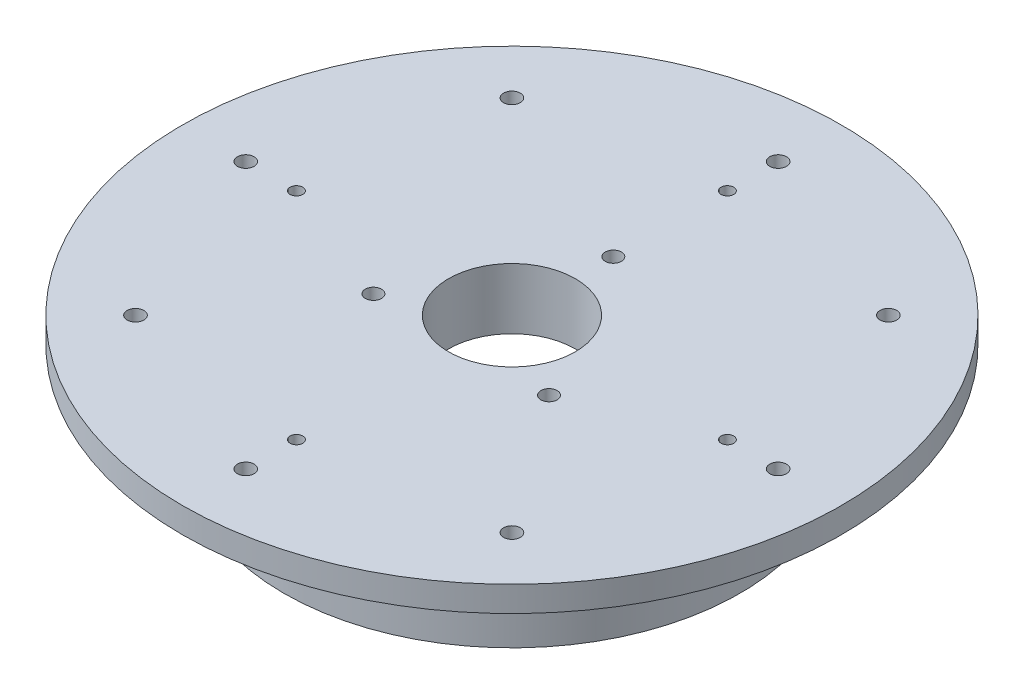
ISO-10303-21;
HEADER;
FILE_DESCRIPTION(('STEP AP214'),'2;1');
FILE_NAME('part.step','',(''),(''),'','','');
FILE_SCHEMA(('AUTOMOTIVE_DESIGN { 1 0 10303 214 1 1 1 1 }'));
ENDSEC;
DATA;
#1=APPLICATION_CONTEXT('core data for automotive mechanical design processes');
#2=APPLICATION_PROTOCOL_DEFINITION('international standard','automotive_design',2000,#1);
#3=PRODUCT_CONTEXT('',#1,'mechanical');
#4=PRODUCT('Part','Part','',(#3));
#5=PRODUCT_RELATED_PRODUCT_CATEGORY('part','',(#4));
#6=PRODUCT_DEFINITION_FORMATION('','',#4);
#7=PRODUCT_DEFINITION_CONTEXT('part definition',#1,'design');
#8=PRODUCT_DEFINITION('design','',#6,#7);
#9=PRODUCT_DEFINITION_SHAPE('','',#8);
#10=(LENGTH_UNIT() NAMED_UNIT(*) SI_UNIT(.MILLI.,.METRE.));
#11=(NAMED_UNIT(*) PLANE_ANGLE_UNIT() SI_UNIT($,.RADIAN.));
#12=(NAMED_UNIT(*) SI_UNIT($,.STERADIAN.) SOLID_ANGLE_UNIT());
#13=UNCERTAINTY_MEASURE_WITH_UNIT(LENGTH_MEASURE(1.E-05),#10,'distance_accuracy_value','');
#14=(GEOMETRIC_REPRESENTATION_CONTEXT(3) GLOBAL_UNCERTAINTY_ASSIGNED_CONTEXT((#13)) GLOBAL_UNIT_ASSIGNED_CONTEXT((#10,
#11,#12)) REPRESENTATION_CONTEXT('',''));
#15=CARTESIAN_POINT('',(0.,0.,0.));
#16=DIRECTION('',(0.,0.,1.));
#17=DIRECTION('',(1.,0.,0.));
#18=AXIS2_PLACEMENT_3D('',#15,#16,#17);
#19=CARTESIAN_POINT('',(0.,-7.,0.));
#20=DIRECTION('',(0.,-1.,0.));
#21=DIRECTION('',(0.,0.,-1.));
#22=AXIS2_PLACEMENT_3D('',#19,#20,#21);
#23=PLANE('',#22);
#24=CARTESIAN_POINT('',(-17.3205080756875,-7.,10.0000000000007));
#25=DIRECTION('',(0.,-1.,0.));
#26=DIRECTION('',(0.,0.,-1.));
#27=AXIS2_PLACEMENT_3D('',#24,#25,#26);
#28=CIRCLE('',#27,1.60000000000161);
#29=CARTESIAN_POINT('',(-17.3205080756875,-7.,8.39999999999913));
#30=VERTEX_POINT('',#29);
#31=EDGE_CURVE('E142',#30,#30,#28,.T.);
#32=ORIENTED_EDGE('',*,*,#31,.F.);
#33=EDGE_LOOP('',(#32));
#34=FACE_BOUND('',#33,.T.);
#35=CARTESIAN_POINT('',(17.3205080756901,-7.,9.99999999999926));
#36=DIRECTION('',(0.,-1.,0.));
#37=DIRECTION('',(0.,0.,-1.));
#38=AXIS2_PLACEMENT_3D('',#35,#36,#37);
#39=CIRCLE('',#38,1.60000000000109);
#40=CARTESIAN_POINT('',(17.3205080756901,-7.,8.39999999999817));
#41=VERTEX_POINT('',#40);
#42=EDGE_CURVE('E157',#41,#41,#39,.T.);
#43=ORIENTED_EDGE('',*,*,#42,.F.);
#44=EDGE_LOOP('',(#43));
#45=FACE_BOUND('',#44,.T.);
#46=CARTESIAN_POINT('',(0.,-7.,-20.));
#47=DIRECTION('',(0.,-1.,0.));
#48=DIRECTION('',(0.,0.,-1.));
#49=AXIS2_PLACEMENT_3D('',#46,#47,#48);
#50=CIRCLE('',#49,1.6);
#51=CARTESIAN_POINT('',(0.,-7.,-21.6));
#52=VERTEX_POINT('',#51);
#53=EDGE_CURVE('E53',#52,#52,#50,.T.);
#54=ORIENTED_EDGE('',*,*,#53,.F.);
#55=EDGE_LOOP('',(#54));
#56=FACE_BOUND('',#55,.T.);
#57=CARTESIAN_POINT('',(0.,-7.,0.));
#58=DIRECTION('',(0.,-1.,0.));
#59=DIRECTION('',(0.,0.,-1.));
#60=AXIS2_PLACEMENT_3D('',#57,#58,#59);
#61=CIRCLE('',#60,12.5);
#62=CARTESIAN_POINT('',(0.,-7.,-12.5));
#63=VERTEX_POINT('',#62);
#64=EDGE_CURVE('E130',#63,#63,#61,.T.);
#65=ORIENTED_EDGE('',*,*,#64,.F.);
#66=EDGE_LOOP('',(#65));
#67=FACE_BOUND('',#66,.T.);
#68=CARTESIAN_POINT('',(0.,-7.,0.));
#69=DIRECTION('',(0.,-1.,0.));
#70=DIRECTION('',(0.,0.,-1.));
#71=AXIS2_PLACEMENT_3D('',#68,#69,#70);
#72=CIRCLE('',#71,40.);
#73=CARTESIAN_POINT('',(0.,-7.,40.));
#74=VERTEX_POINT('',#73);
#75=EDGE_CURVE('E10',#74,#74,#72,.F.);
#76=ORIENTED_EDGE('',*,*,#75,.F.);
#77=EDGE_LOOP('',(#76));
#78=FACE_BOUND('',#77,.T.);
#79=ADVANCED_FACE('F36',(#34,#45,#56,#67,#78),#23,.T.);
#80=CARTESIAN_POINT('',(0.,5.,0.));
#81=DIRECTION('',(0.,-1.,0.));
#82=DIRECTION('',(0.,0.,-1.));
#83=AXIS2_PLACEMENT_3D('',#80,#81,#82);
#84=CYLINDRICAL_SURFACE('',#83,65.);
#85=CARTESIAN_POINT('',(0.,5.,0.));
#86=DIRECTION('',(0.,1.,0.));
#87=DIRECTION('',(0.,0.,1.));
#88=AXIS2_PLACEMENT_3D('',#85,#86,#87);
#89=CIRCLE('',#88,65.);
#90=CARTESIAN_POINT('',(0.,5.,65.));
#91=VERTEX_POINT('',#90);
#92=EDGE_CURVE('E49',#91,#91,#89,.T.);
#93=ORIENTED_EDGE('',*,*,#92,.F.);
#94=EDGE_LOOP('',(#93));
#95=FACE_BOUND('',#94,.T.);
#96=CARTESIAN_POINT('',(0.,0.,0.));
#97=DIRECTION('',(0.,1.,0.));
#98=DIRECTION('',(0.,0.,1.));
#99=AXIS2_PLACEMENT_3D('',#96,#97,#98);
#100=CIRCLE('',#99,65.);
#101=CARTESIAN_POINT('',(0.,0.,65.));
#102=VERTEX_POINT('',#101);
#103=EDGE_CURVE('E150',#102,#102,#100,.T.);
#104=ORIENTED_EDGE('',*,*,#103,.T.);
#105=EDGE_LOOP('',(#104));
#106=FACE_BOUND('',#105,.T.);
#107=ADVANCED_FACE('F38',(#95,#106),#84,.T.);
#108=CARTESIAN_POINT('',(0.,5.,0.));
#109=DIRECTION('',(0.,1.,0.));
#110=DIRECTION('',(0.,0.,1.));
#111=AXIS2_PLACEMENT_3D('',#108,#109,#110);
#112=PLANE('',#111);
#113=CARTESIAN_POINT('',(0.,5.,-52.5));
#114=DIRECTION('',(0.,1.,0.));
#115=DIRECTION('',(0.,0.,1.));
#116=AXIS2_PLACEMENT_3D('',#113,#114,#115);
#117=CIRCLE('',#116,1.64999999999999);
#118=CARTESIAN_POINT('',(0.,5.,-50.85));
#119=VERTEX_POINT('',#118);
#120=EDGE_CURVE('E496',#119,#119,#117,.T.);
#121=ORIENTED_EDGE('',*,*,#120,.F.);
#122=EDGE_LOOP('',(#121));
#123=FACE_BOUND('',#122,.T.);
#124=CARTESIAN_POINT('',(37.1231060122944,5.,-37.1231060122954));
#125=DIRECTION('',(0.,1.,0.));
#126=DIRECTION('',(0.,0.,1.));
#127=AXIS2_PLACEMENT_3D('',#124,#125,#126);
#128=CIRCLE('',#127,1.64999999999999);
#129=CARTESIAN_POINT('',(37.1231060122944,5.,-35.4731060122954));
#130=VERTEX_POINT('',#129);
#131=EDGE_CURVE('E77',#130,#130,#128,.T.);
#132=ORIENTED_EDGE('',*,*,#131,.F.);
#133=EDGE_LOOP('',(#132));
#134=FACE_BOUND('',#133,.T.);
#135=CARTESIAN_POINT('',(52.5000000000023,5.,-2.33453461106547E-12));
#136=DIRECTION('',(0.,1.,0.));
#137=DIRECTION('',(0.,0.,1.));
#138=AXIS2_PLACEMENT_3D('',#135,#136,#137);
#139=CIRCLE('',#138,1.64999999999999);
#140=CARTESIAN_POINT('',(52.5000000000023,5.,1.64999999999766));
#141=VERTEX_POINT('',#140);
#142=EDGE_CURVE('E66',#141,#141,#139,.T.);
#143=ORIENTED_EDGE('',*,*,#142,.F.);
#144=EDGE_LOOP('',(#143));
#145=FACE_BOUND('',#144,.T.);
#146=CARTESIAN_POINT('',(37.1231060122977,5.,37.1231060122921));
#147=DIRECTION('',(0.,1.,0.));
#148=DIRECTION('',(0.,0.,1.));
#149=AXIS2_PLACEMENT_3D('',#146,#147,#148);
#150=CIRCLE('',#149,1.64999999999999);
#151=CARTESIAN_POINT('',(37.1231060122977,5.,38.7731060122921));
#152=VERTEX_POINT('',#151);
#153=EDGE_CURVE('E63',#152,#152,#150,.T.);
#154=ORIENTED_EDGE('',*,*,#153,.F.);
#155=EDGE_LOOP('',(#154));
#156=FACE_BOUND('',#155,.T.);
#157=CARTESIAN_POINT('',(4.66906922213094E-12,5.,52.5));
#158=DIRECTION('',(0.,1.,0.));
#159=DIRECTION('',(0.,0.,1.));
#160=AXIS2_PLACEMENT_3D('',#157,#158,#159);
#161=CIRCLE('',#160,1.64999999999999);
#162=CARTESIAN_POINT('',(4.66906922213094E-12,5.,54.15));
#163=VERTEX_POINT('',#162);
#164=EDGE_CURVE('E62',#163,#163,#161,.T.);
#165=ORIENTED_EDGE('',*,*,#164,.F.);
#166=EDGE_LOOP('',(#165));
#167=FACE_BOUND('',#166,.T.);
#168=CARTESIAN_POINT('',(-37.1231060122898,5.,37.1231060122954));
#169=DIRECTION('',(0.,1.,0.));
#170=DIRECTION('',(0.,0.,1.));
#171=AXIS2_PLACEMENT_3D('',#168,#169,#170);
#172=CIRCLE('',#171,1.64999999999999);
#173=CARTESIAN_POINT('',(-37.1231060122898,5.,38.7731060122954));
#174=VERTEX_POINT('',#173);
#175=EDGE_CURVE('E86',#174,#174,#172,.T.);
#176=ORIENTED_EDGE('',*,*,#175,.F.);
#177=EDGE_LOOP('',(#176));
#178=FACE_BOUND('',#177,.T.);
#179=CARTESIAN_POINT('',(-52.4999999999977,5.,2.340964006761E-12));
#180=DIRECTION('',(0.,1.,0.));
#181=DIRECTION('',(0.,0.,1.));
#182=AXIS2_PLACEMENT_3D('',#179,#180,#181);
#183=CIRCLE('',#182,1.64999999999999);
#184=CARTESIAN_POINT('',(-52.4999999999977,5.,1.65000000000233));
#185=VERTEX_POINT('',#184);
#186=EDGE_CURVE('E92',#185,#185,#183,.T.);
#187=ORIENTED_EDGE('',*,*,#186,.F.);
#188=EDGE_LOOP('',(#187));
#189=FACE_BOUND('',#188,.T.);
#190=CARTESIAN_POINT('',(-37.1231060122931,5.,-37.1231060122921));
#191=DIRECTION('',(0.,1.,0.));
#192=DIRECTION('',(0.,0.,1.));
#193=AXIS2_PLACEMENT_3D('',#190,#191,#192);
#194=CIRCLE('',#193,1.64999999999999);
#195=CARTESIAN_POINT('',(-37.1231060122931,5.,-35.4731060122921));
#196=VERTEX_POINT('',#195);
#197=EDGE_CURVE('E59',#196,#196,#194,.T.);
#198=ORIENTED_EDGE('',*,*,#197,.F.);
#199=EDGE_LOOP('',(#198));
#200=FACE_BOUND('',#199,.T.);
#201=CARTESIAN_POINT('',(0.,5.,42.5));
#202=DIRECTION('',(0.,-1.,0.));
#203=DIRECTION('',(0.,0.,-1.));
#204=AXIS2_PLACEMENT_3D('',#201,#202,#203);
#205=CIRCLE('',#204,1.25);
#206=CARTESIAN_POINT('',(0.,5.,41.25));
#207=VERTEX_POINT('',#206);
#208=EDGE_CURVE('E102',#207,#207,#205,.T.);
#209=ORIENTED_EDGE('',*,*,#208,.T.);
#210=EDGE_LOOP('',(#209));
#211=FACE_BOUND('',#210,.T.);
#212=CARTESIAN_POINT('',(-42.5,5.,4.451638707025E-13));
#213=DIRECTION('',(0.,-1.,0.));
#214=DIRECTION('',(0.,0.,-1.));
#215=AXIS2_PLACEMENT_3D('',#212,#213,#214);
#216=CIRCLE('',#215,1.24999999999999);
#217=CARTESIAN_POINT('',(-42.5,5.,-1.24999999999955));
#218=VERTEX_POINT('',#217);
#219=EDGE_CURVE('E108',#218,#218,#216,.T.);
#220=ORIENTED_EDGE('',*,*,#219,.T.);
#221=EDGE_LOOP('',(#220));
#222=FACE_BOUND('',#221,.T.);
#223=CARTESIAN_POINT('',(-2.96775913801666E-13,5.,-42.5));
#224=DIRECTION('',(0.,-1.,0.));
#225=DIRECTION('',(0.,0.,-1.));
#226=AXIS2_PLACEMENT_3D('',#223,#224,#225);
#227=CIRCLE('',#226,1.25);
#228=CARTESIAN_POINT('',(-2.96775913801666E-13,5.,-43.75));
#229=VERTEX_POINT('',#228);
#230=EDGE_CURVE('E114',#229,#229,#227,.T.);
#231=ORIENTED_EDGE('',*,*,#230,.T.);
#232=EDGE_LOOP('',(#231));
#233=FACE_BOUND('',#232,.T.);
#234=CARTESIAN_POINT('',(42.5,5.,-1.48387956900833E-13));
#235=DIRECTION('',(0.,-1.,0.));
#236=DIRECTION('',(0.,0.,-1.));
#237=AXIS2_PLACEMENT_3D('',#234,#235,#236);
#238=CIRCLE('',#237,1.24999999999999);
#239=CARTESIAN_POINT('',(42.5,5.,-1.25000000000014));
#240=VERTEX_POINT('',#239);
#241=EDGE_CURVE('E120',#240,#240,#238,.T.);
#242=ORIENTED_EDGE('',*,*,#241,.T.);
#243=EDGE_LOOP('',(#242));
#244=FACE_BOUND('',#243,.T.);
#245=CARTESIAN_POINT('',(0.,5.,0.));
#246=DIRECTION('',(0.,-1.,0.));
#247=DIRECTION('',(0.,0.,-1.));
#248=AXIS2_PLACEMENT_3D('',#245,#246,#247);
#249=CIRCLE('',#248,12.5);
#250=CARTESIAN_POINT('',(0.,5.,-12.5));
#251=VERTEX_POINT('',#250);
#252=EDGE_CURVE('E133',#251,#251,#249,.T.);
#253=ORIENTED_EDGE('',*,*,#252,.T.);
#254=EDGE_LOOP('',(#253));
#255=FACE_BOUND('',#254,.T.);
#256=CARTESIAN_POINT('',(0.,5.,-20.));
#257=DIRECTION('',(0.,1.,0.));
#258=DIRECTION('',(0.,0.,1.));
#259=AXIS2_PLACEMENT_3D('',#256,#257,#258);
#260=CIRCLE('',#259,1.6);
#261=CARTESIAN_POINT('',(0.,5.,-18.4));
#262=VERTEX_POINT('',#261);
#263=EDGE_CURVE('E139',#262,#262,#260,.T.);
#264=ORIENTED_EDGE('',*,*,#263,.F.);
#265=EDGE_LOOP('',(#264));
#266=FACE_BOUND('',#265,.T.);
#267=CARTESIAN_POINT('',(17.3205080756901,5.,9.99999999999926));
#268=DIRECTION('',(0.,1.,0.));
#269=DIRECTION('',(0.,0.,1.));
#270=AXIS2_PLACEMENT_3D('',#267,#268,#269);
#271=CIRCLE('',#270,1.60000000000109);
#272=CARTESIAN_POINT('',(17.3205080756901,5.,11.6000000000004));
#273=VERTEX_POINT('',#272);
#274=EDGE_CURVE('E143',#273,#273,#271,.T.);
#275=ORIENTED_EDGE('',*,*,#274,.F.);
#276=EDGE_LOOP('',(#275));
#277=FACE_BOUND('',#276,.T.);
#278=CARTESIAN_POINT('',(-17.3205080756875,5.,10.0000000000007));
#279=DIRECTION('',(0.,1.,0.));
#280=DIRECTION('',(0.,0.,1.));
#281=AXIS2_PLACEMENT_3D('',#278,#279,#280);
#282=CIRCLE('',#281,1.60000000000161);
#283=CARTESIAN_POINT('',(-17.3205080756875,5.,11.6000000000024));
#284=VERTEX_POINT('',#283);
#285=EDGE_CURVE('E136',#284,#284,#282,.T.);
#286=ORIENTED_EDGE('',*,*,#285,.F.);
#287=EDGE_LOOP('',(#286));
#288=FACE_BOUND('',#287,.T.);
#289=ORIENTED_EDGE('',*,*,#92,.T.);
#290=EDGE_LOOP('',(#289));
#291=FACE_BOUND('',#290,.T.);
#292=ADVANCED_FACE('F205',(#123,#134,#145,#156,#167,#178,#189,#200,#211,#222,#233,#244,#255,
#266,#277,#288,#291),#112,.T.);
#293=CARTESIAN_POINT('',(0.,0.,0.));
#294=DIRECTION('',(0.,1.,0.));
#295=DIRECTION('',(0.,0.,1.));
#296=AXIS2_PLACEMENT_3D('',#293,#294,#295);
#297=PLANE('',#296);
#298=CARTESIAN_POINT('',(0.,0.,-52.5));
#299=DIRECTION('',(0.,1.,0.));
#300=DIRECTION('',(0.,0.,1.));
#301=AXIS2_PLACEMENT_3D('',#298,#299,#300);
#302=CIRCLE('',#301,1.64999999999999);
#303=CARTESIAN_POINT('',(0.,0.,-50.85));
#304=VERTEX_POINT('',#303);
#305=EDGE_CURVE('E40',#304,#304,#302,.T.);
#306=ORIENTED_EDGE('',*,*,#305,.T.);
#307=EDGE_LOOP('',(#306));
#308=FACE_BOUND('',#307,.T.);
#309=CARTESIAN_POINT('',(37.1231060122944,0.,-37.1231060122954));
#310=DIRECTION('',(0.,1.,0.));
#311=DIRECTION('',(0.,0.,1.));
#312=AXIS2_PLACEMENT_3D('',#309,#310,#311);
#313=CIRCLE('',#312,1.64999999999999);
#314=CARTESIAN_POINT('',(37.1231060122944,0.,-35.4731060122954));
#315=VERTEX_POINT('',#314);
#316=EDGE_CURVE('E72',#315,#315,#313,.T.);
#317=ORIENTED_EDGE('',*,*,#316,.T.);
#318=EDGE_LOOP('',(#317));
#319=FACE_BOUND('',#318,.T.);
#320=CARTESIAN_POINT('',(52.5000000000023,0.,-2.33453461106547E-12));
#321=DIRECTION('',(0.,1.,0.));
#322=DIRECTION('',(0.,0.,1.));
#323=AXIS2_PLACEMENT_3D('',#320,#321,#322);
#324=CIRCLE('',#323,1.64999999999999);
#325=CARTESIAN_POINT('',(52.5000000000023,0.,1.64999999999765));
#326=VERTEX_POINT('',#325);
#327=EDGE_CURVE('E64',#326,#326,#324,.T.);
#328=ORIENTED_EDGE('',*,*,#327,.T.);
#329=EDGE_LOOP('',(#328));
#330=FACE_BOUND('',#329,.T.);
#331=CARTESIAN_POINT('',(37.1231060122977,0.,37.1231060122921));
#332=DIRECTION('',(0.,1.,0.));
#333=DIRECTION('',(0.,0.,1.));
#334=AXIS2_PLACEMENT_3D('',#331,#332,#333);
#335=CIRCLE('',#334,1.64999999999999);
#336=CARTESIAN_POINT('',(37.1231060122977,0.,38.7731060122921));
#337=VERTEX_POINT('',#336);
#338=EDGE_CURVE('E60',#337,#337,#335,.T.);
#339=ORIENTED_EDGE('',*,*,#338,.T.);
#340=EDGE_LOOP('',(#339));
#341=FACE_BOUND('',#340,.T.);
#342=CARTESIAN_POINT('',(4.66906922213094E-12,0.,52.5));
#343=DIRECTION('',(0.,1.,0.));
#344=DIRECTION('',(0.,0.,1.));
#345=AXIS2_PLACEMENT_3D('',#342,#343,#344);
#346=CIRCLE('',#345,1.64999999999999);
#347=CARTESIAN_POINT('',(4.66906922213094E-12,0.,54.15));
#348=VERTEX_POINT('',#347);
#349=EDGE_CURVE('E83',#348,#348,#346,.T.);
#350=ORIENTED_EDGE('',*,*,#349,.T.);
#351=EDGE_LOOP('',(#350));
#352=FACE_BOUND('',#351,.T.);
#353=CARTESIAN_POINT('',(-37.1231060122898,0.,37.1231060122954));
#354=DIRECTION('',(0.,1.,0.));
#355=DIRECTION('',(0.,0.,1.));
#356=AXIS2_PLACEMENT_3D('',#353,#354,#355);
#357=CIRCLE('',#356,1.64999999999999);
#358=CARTESIAN_POINT('',(-37.1231060122898,0.,38.7731060122954));
#359=VERTEX_POINT('',#358);
#360=EDGE_CURVE('E89',#359,#359,#357,.T.);
#361=ORIENTED_EDGE('',*,*,#360,.T.);
#362=EDGE_LOOP('',(#361));
#363=FACE_BOUND('',#362,.T.);
#364=CARTESIAN_POINT('',(-52.4999999999977,0.,2.340964006761E-12));
#365=DIRECTION('',(0.,1.,0.));
#366=DIRECTION('',(0.,0.,1.));
#367=AXIS2_PLACEMENT_3D('',#364,#365,#366);
#368=CIRCLE('',#367,1.64999999999999);
#369=CARTESIAN_POINT('',(-52.4999999999977,0.,1.65000000000233));
#370=VERTEX_POINT('',#369);
#371=EDGE_CURVE('E95',#370,#370,#368,.T.);
#372=ORIENTED_EDGE('',*,*,#371,.T.);
#373=EDGE_LOOP('',(#372));
#374=FACE_BOUND('',#373,.T.);
#375=CARTESIAN_POINT('',(-37.1231060122931,0.,-37.1231060122921));
#376=DIRECTION('',(0.,1.,0.));
#377=DIRECTION('',(0.,0.,1.));
#378=AXIS2_PLACEMENT_3D('',#375,#376,#377);
#379=CIRCLE('',#378,1.64999999999999);
#380=CARTESIAN_POINT('',(-37.1231060122931,0.,-35.4731060122921));
#381=VERTEX_POINT('',#380);
#382=EDGE_CURVE('E55',#381,#381,#379,.T.);
#383=ORIENTED_EDGE('',*,*,#382,.T.);
#384=EDGE_LOOP('',(#383));
#385=FACE_BOUND('',#384,.T.);
#386=CARTESIAN_POINT('',(0.,0.,0.));
#387=DIRECTION('',(0.,-1.,0.));
#388=DIRECTION('',(0.,0.,-1.));
#389=AXIS2_PLACEMENT_3D('',#386,#387,#388);
#390=CIRCLE('',#389,50.);
#391=CARTESIAN_POINT('',(0.,0.,-50.));
#392=VERTEX_POINT('',#391);
#393=EDGE_CURVE('E44',#392,#392,#390,.T.);
#394=ORIENTED_EDGE('',*,*,#393,.F.);
#395=EDGE_LOOP('',(#394));
#396=FACE_BOUND('',#395,.T.);
#397=ORIENTED_EDGE('',*,*,#103,.F.);
#398=EDGE_LOOP('',(#397));
#399=FACE_BOUND('',#398,.T.);
#400=ADVANCED_FACE('F203',(#308,#319,#330,#341,#352,#363,#374,#385,#396,#399),#297,.F.);
#401=CARTESIAN_POINT('',(0.,-7.,0.));
#402=DIRECTION('',(0.,1.,0.));
#403=DIRECTION('',(0.,0.,1.));
#404=AXIS2_PLACEMENT_3D('',#401,#402,#403);
#405=CYLINDRICAL_SURFACE('',#404,50.);
#406=CARTESIAN_POINT('',(0.,-7.,0.));
#407=DIRECTION('',(0.,-1.,0.));
#408=DIRECTION('',(0.,0.,-1.));
#409=AXIS2_PLACEMENT_3D('',#406,#407,#408);
#410=CIRCLE('',#409,50.);
#411=CARTESIAN_POINT('',(0.,-7.,-50.));
#412=VERTEX_POINT('',#411);
#413=EDGE_CURVE('E148',#412,#412,#410,.T.);
#414=ORIENTED_EDGE('',*,*,#413,.F.);
#415=EDGE_LOOP('',(#414));
#416=FACE_BOUND('',#415,.T.);
#417=ORIENTED_EDGE('',*,*,#393,.T.);
#418=EDGE_LOOP('',(#417));
#419=FACE_BOUND('',#418,.T.);
#420=ADVANCED_FACE('F199',(#416,#419),#405,.T.);
#421=CARTESIAN_POINT('',(0.,-7.,0.));
#422=DIRECTION('',(0.,-1.,0.));
#423=DIRECTION('',(0.,0.,-1.));
#424=AXIS2_PLACEMENT_3D('',#421,#422,#423);
#425=CIRCLE('',#424,45.);
#426=CARTESIAN_POINT('',(0.,-7.,45.));
#427=VERTEX_POINT('',#426);
#428=EDGE_CURVE('E126',#427,#427,#425,.T.);
#429=ORIENTED_EDGE('',*,*,#428,.F.);
#430=EDGE_LOOP('',(#429));
#431=FACE_BOUND('',#430,.T.);
#432=ORIENTED_EDGE('',*,*,#413,.T.);
#433=EDGE_LOOP('',(#432));
#434=FACE_BOUND('',#433,.T.);
#435=ADVANCED_FACE('F171',(#431,#434),#23,.T.);
#436=CARTESIAN_POINT('',(-17.3205080756875,-53.,10.0000000000007));
#437=DIRECTION('',(0.,1.,0.));
#438=DIRECTION('',(0.,0.,1.));
#439=AXIS2_PLACEMENT_3D('',#436,#437,#438);
#440=CYLINDRICAL_SURFACE('',#439,1.60000000000161);
#441=ORIENTED_EDGE('',*,*,#31,.T.);
#442=EDGE_LOOP('',(#441));
#443=FACE_BOUND('',#442,.T.);
#444=ORIENTED_EDGE('',*,*,#285,.T.);
#445=EDGE_LOOP('',(#444));
#446=FACE_BOUND('',#445,.T.);
#447=ADVANCED_FACE('F194',(#443,#446),#440,.F.);
#448=CARTESIAN_POINT('',(17.3205080756901,-53.,9.99999999999926));
#449=DIRECTION('',(0.,1.,0.));
#450=DIRECTION('',(0.,0.,1.));
#451=AXIS2_PLACEMENT_3D('',#448,#449,#450);
#452=CYLINDRICAL_SURFACE('',#451,1.60000000000109);
#453=ORIENTED_EDGE('',*,*,#42,.T.);
#454=EDGE_LOOP('',(#453));
#455=FACE_BOUND('',#454,.T.);
#456=ORIENTED_EDGE('',*,*,#274,.T.);
#457=EDGE_LOOP('',(#456));
#458=FACE_BOUND('',#457,.T.);
#459=ADVANCED_FACE('F187',(#455,#458),#452,.F.);
#460=CARTESIAN_POINT('',(0.,-53.,-20.));
#461=DIRECTION('',(0.,1.,0.));
#462=DIRECTION('',(0.,0.,1.));
#463=AXIS2_PLACEMENT_3D('',#460,#461,#462);
#464=CYLINDRICAL_SURFACE('',#463,1.6);
#465=ORIENTED_EDGE('',*,*,#53,.T.);
#466=EDGE_LOOP('',(#465));
#467=FACE_BOUND('',#466,.T.);
#468=ORIENTED_EDGE('',*,*,#263,.T.);
#469=EDGE_LOOP('',(#468));
#470=FACE_BOUND('',#469,.T.);
#471=ADVANCED_FACE('F164',(#467,#470),#464,.F.);
#472=CARTESIAN_POINT('',(0.,5.,0.));
#473=DIRECTION('',(0.,-1.,0.));
#474=DIRECTION('',(0.,0.,-1.));
#475=AXIS2_PLACEMENT_3D('',#472,#473,#474);
#476=CYLINDRICAL_SURFACE('',#475,12.5);
#477=ORIENTED_EDGE('',*,*,#252,.F.);
#478=EDGE_LOOP('',(#477));
#479=FACE_BOUND('',#478,.T.);
#480=ORIENTED_EDGE('',*,*,#64,.T.);
#481=EDGE_LOOP('',(#480));
#482=FACE_BOUND('',#481,.T.);
#483=ADVANCED_FACE('F175',(#479,#482),#476,.F.);
#484=CARTESIAN_POINT('',(0.,-20.,0.));
#485=DIRECTION('',(0.,-1.,0.));
#486=DIRECTION('',(0.,0.,-1.));
#487=AXIS2_PLACEMENT_3D('',#484,#485,#486);
#488=PLANE('',#487);
#489=CARTESIAN_POINT('',(0.,-20.,42.5));
#490=DIRECTION('',(0.,-1.,0.));
#491=DIRECTION('',(0.,0.,-1.));
#492=AXIS2_PLACEMENT_3D('',#489,#490,#491);
#493=CIRCLE('',#492,1.25);
#494=CARTESIAN_POINT('',(0.,-20.,41.25));
#495=VERTEX_POINT('',#494);
#496=EDGE_CURVE('E58',#495,#495,#493,.T.);
#497=ORIENTED_EDGE('',*,*,#496,.F.);
#498=EDGE_LOOP('',(#497));
#499=FACE_BOUND('',#498,.T.);
#500=CARTESIAN_POINT('',(-42.5,-20.,4.451638707025E-13));
#501=DIRECTION('',(0.,-1.,0.));
#502=DIRECTION('',(0.,0.,-1.));
#503=AXIS2_PLACEMENT_3D('',#500,#501,#502);
#504=CIRCLE('',#503,1.25);
#505=CARTESIAN_POINT('',(-42.5,-20.,-1.24999999999956));
#506=VERTEX_POINT('',#505);
#507=EDGE_CURVE('E105',#506,#506,#504,.T.);
#508=ORIENTED_EDGE('',*,*,#507,.F.);
#509=EDGE_LOOP('',(#508));
#510=FACE_BOUND('',#509,.T.);
#511=CARTESIAN_POINT('',(-2.96775913801666E-13,-20.,-42.5));
#512=DIRECTION('',(0.,-1.,0.));
#513=DIRECTION('',(0.,0.,-1.));
#514=AXIS2_PLACEMENT_3D('',#511,#512,#513);
#515=CIRCLE('',#514,1.25);
#516=CARTESIAN_POINT('',(-2.96775913801666E-13,-20.,-43.75));
#517=VERTEX_POINT('',#516);
#518=EDGE_CURVE('E111',#517,#517,#515,.T.);
#519=ORIENTED_EDGE('',*,*,#518,.F.);
#520=EDGE_LOOP('',(#519));
#521=FACE_BOUND('',#520,.T.);
#522=CARTESIAN_POINT('',(42.5,-20.,-1.48387956900833E-13));
#523=DIRECTION('',(0.,-1.,0.));
#524=DIRECTION('',(0.,0.,-1.));
#525=AXIS2_PLACEMENT_3D('',#522,#523,#524);
#526=CIRCLE('',#525,1.25);
#527=CARTESIAN_POINT('',(42.5,-20.,-1.25000000000015));
#528=VERTEX_POINT('',#527);
#529=EDGE_CURVE('E117',#528,#528,#526,.T.);
#530=ORIENTED_EDGE('',*,*,#529,.F.);
#531=EDGE_LOOP('',(#530));
#532=FACE_BOUND('',#531,.T.);
#533=CARTESIAN_POINT('',(0.,-20.,0.));
#534=DIRECTION('',(0.,-1.,0.));
#535=DIRECTION('',(0.,0.,-1.));
#536=AXIS2_PLACEMENT_3D('',#533,#534,#535);
#537=CIRCLE('',#536,45.);
#538=CARTESIAN_POINT('',(0.,-20.,45.));
#539=VERTEX_POINT('',#538);
#540=EDGE_CURVE('E127',#539,#539,#537,.T.);
#541=ORIENTED_EDGE('',*,*,#540,.T.);
#542=EDGE_LOOP('',(#541));
#543=FACE_BOUND('',#542,.T.);
#544=CARTESIAN_POINT('',(0.,-20.,0.));
#545=DIRECTION('',(0.,-1.,0.));
#546=DIRECTION('',(0.,0.,-1.));
#547=AXIS2_PLACEMENT_3D('',#544,#545,#546);
#548=CIRCLE('',#547,40.);
#549=CARTESIAN_POINT('',(0.,-20.,40.));
#550=VERTEX_POINT('',#549);
#551=EDGE_CURVE('E123',#550,#550,#548,.T.);
#552=ORIENTED_EDGE('',*,*,#551,.F.);
#553=EDGE_LOOP('',(#552));
#554=FACE_BOUND('',#553,.T.);
#555=ADVANCED_FACE('F177',(#499,#510,#521,#532,#543,#554),#488,.T.);
#556=CARTESIAN_POINT('',(0.,-20.,0.));
#557=DIRECTION('',(0.,1.,0.));
#558=DIRECTION('',(0.,0.,1.));
#559=AXIS2_PLACEMENT_3D('',#556,#557,#558);
#560=CYLINDRICAL_SURFACE('',#559,45.);
#561=CARTESIAN_POINT('',(0.,-20.,45.));
#562=CARTESIAN_POINT('',(0.,-19.8645833333333,45.));
#563=CARTESIAN_POINT('',(0.,-19.7291666666667,45.));
#564=CARTESIAN_POINT('',(0.,-19.4583333333333,45.));
#565=CARTESIAN_POINT('',(0.,-19.3229166666667,45.));
#566=CARTESIAN_POINT('',(0.,-19.0520833333333,45.));
#567=CARTESIAN_POINT('',(0.,-18.9166666666667,45.));
#568=CARTESIAN_POINT('',(0.,-18.6458333333333,45.));
#569=CARTESIAN_POINT('',(0.,-18.5104166666667,45.));
#570=CARTESIAN_POINT('',(0.,-18.2395833333333,45.));
#571=CARTESIAN_POINT('',(0.,-18.1041666666667,45.));
#572=CARTESIAN_POINT('',(0.,-17.8333333333333,45.));
#573=CARTESIAN_POINT('',(0.,-17.6979166666667,45.));
#574=CARTESIAN_POINT('',(0.,-17.4270833333333,45.));
#575=CARTESIAN_POINT('',(0.,-17.2916666666667,45.));
#576=CARTESIAN_POINT('',(0.,-17.0208333333333,45.));
#577=CARTESIAN_POINT('',(0.,-16.8854166666667,45.));
#578=CARTESIAN_POINT('',(0.,-16.6145833333333,45.));
#579=CARTESIAN_POINT('',(0.,-16.4791666666667,45.));
#580=CARTESIAN_POINT('',(0.,-16.2083333333333,45.));
#581=CARTESIAN_POINT('',(0.,-16.0729166666667,45.));
#582=CARTESIAN_POINT('',(0.,-15.8020833333333,45.));
#583=CARTESIAN_POINT('',(0.,-15.6666666666667,45.));
#584=CARTESIAN_POINT('',(0.,-15.3958333333333,45.));
#585=CARTESIAN_POINT('',(0.,-15.2604166666667,45.));
#586=CARTESIAN_POINT('',(0.,-14.9895833333333,45.));
#587=CARTESIAN_POINT('',(0.,-14.8541666666667,45.));
#588=CARTESIAN_POINT('',(0.,-14.5833333333333,45.));
#589=CARTESIAN_POINT('',(0.,-14.4479166666667,45.));
#590=CARTESIAN_POINT('',(0.,-14.1770833333333,45.));
#591=CARTESIAN_POINT('',(0.,-14.0416666666667,45.));
#592=CARTESIAN_POINT('',(0.,-13.7708333333333,45.));
#593=CARTESIAN_POINT('',(0.,-13.6354166666667,45.));
#594=CARTESIAN_POINT('',(0.,-13.3645833333333,45.));
#595=CARTESIAN_POINT('',(0.,-13.2291666666667,45.));
#596=CARTESIAN_POINT('',(0.,-12.9583333333333,45.));
#597=CARTESIAN_POINT('',(0.,-12.8229166666667,45.));
#598=CARTESIAN_POINT('',(0.,-12.5520833333333,45.));
#599=CARTESIAN_POINT('',(0.,-12.4166666666667,45.));
#600=CARTESIAN_POINT('',(0.,-12.1458333333333,45.));
#601=CARTESIAN_POINT('',(0.,-12.0104166666667,45.));
#602=CARTESIAN_POINT('',(0.,-11.7395833333333,45.));
#603=CARTESIAN_POINT('',(0.,-11.6041666666667,45.));
#604=CARTESIAN_POINT('',(0.,-11.3333333333333,45.));
#605=CARTESIAN_POINT('',(0.,-11.1979166666667,45.));
#606=CARTESIAN_POINT('',(0.,-10.9270833333333,45.));
#607=CARTESIAN_POINT('',(0.,-10.7916666666667,45.));
#608=CARTESIAN_POINT('',(0.,-10.5208333333333,45.));
#609=CARTESIAN_POINT('',(0.,-10.3854166666667,45.));
#610=CARTESIAN_POINT('',(0.,-10.1145833333333,45.));
#611=CARTESIAN_POINT('',(0.,-9.97916666666667,45.));
#612=CARTESIAN_POINT('',(0.,-9.70833333333333,45.));
#613=CARTESIAN_POINT('',(0.,-9.57291666666667,45.));
#614=CARTESIAN_POINT('',(0.,-9.30208333333333,45.));
#615=CARTESIAN_POINT('',(0.,-9.16666666666667,45.));
#616=CARTESIAN_POINT('',(0.,-8.89583333333333,45.));
#617=CARTESIAN_POINT('',(0.,-8.76041666666667,45.));
#618=CARTESIAN_POINT('',(0.,-8.48958333333333,45.));
#619=CARTESIAN_POINT('',(0.,-8.35416666666667,45.));
#620=CARTESIAN_POINT('',(0.,-8.08333333333333,45.));
#621=CARTESIAN_POINT('',(0.,-7.94791666666667,45.));
#622=CARTESIAN_POINT('',(0.,-7.67708333333333,45.));
#623=CARTESIAN_POINT('',(0.,-7.54166666666667,45.));
#624=CARTESIAN_POINT('',(0.,-7.27083333333333,45.));
#625=CARTESIAN_POINT('',(0.,-7.13541666666667,45.));
#626=CARTESIAN_POINT('',(0.,-7.,45.));
#627=B_SPLINE_CURVE_WITH_KNOTS('',3,(#561,#562,#563,#564,#565,#566,#567,#568,#569,#570,#571,
#572,#573,#574,#575,#576,#577,#578,#579,#580,#581,#582,#583,#584,#585,#586,#587,#588,#589,#590,
#591,#592,#593,#594,#595,#596,#597,#598,#599,#600,#601,#602,#603,#604,#605,#606,#607,#608,#609,
#610,#611,#612,#613,#614,#615,#616,#617,#618,#619,#620,#621,#622,#623,#624,#625,#626),
.UNSPECIFIED.,.F.,.F.,(4,2,2,2,2,2,2,2,2,2,2,2,2,2,2,2,2,2,2,2,2,2,2,2,2,2,2,2,2,2,2,2,4),(0.,
0.406249999999997,0.812499999999997,1.21875,1.625,2.03125,2.4375,2.84375,3.25,3.65625,4.0625,
4.46875,4.875,5.28125,5.6875,6.09375,6.5,6.90625,7.3125,7.71875,8.125,8.53124999999999,8.9375,
9.34375,9.75,10.15625,10.5625,10.96875,11.375,11.78125,12.1875,12.59375,13.),.UNSPECIFIED.);
#628=EDGE_CURVE('BSEAM184',#539,#427,#627,.T.);
#629=ORIENTED_EDGE('',*,*,#540,.F.);
#630=ORIENTED_EDGE('',*,*,#428,.T.);
#631=ORIENTED_EDGE('',*,*,#628,.T.);
#632=ORIENTED_EDGE('',*,*,#628,.F.);
#633=EDGE_LOOP('',(#629,#631,#630,#632));
#634=FACE_BOUND('',#633,.T.);
#635=ADVANCED_FACE('F184',(#634),#560,.T.);
#636=CARTESIAN_POINT('',(0.,-20.,0.));
#637=DIRECTION('',(0.,1.,0.));
#638=DIRECTION('',(0.,0.,1.));
#639=AXIS2_PLACEMENT_3D('',#636,#637,#638);
#640=CYLINDRICAL_SURFACE('',#639,40.);
#641=CARTESIAN_POINT('',(0.,-20.,40.));
#642=CARTESIAN_POINT('',(0.,-19.8645833333333,40.));
#643=CARTESIAN_POINT('',(0.,-19.7291666666667,40.));
#644=CARTESIAN_POINT('',(0.,-19.4583333333333,40.));
#645=CARTESIAN_POINT('',(0.,-19.3229166666667,40.));
#646=CARTESIAN_POINT('',(0.,-19.0520833333333,40.));
#647=CARTESIAN_POINT('',(0.,-18.9166666666667,40.));
#648=CARTESIAN_POINT('',(0.,-18.6458333333333,40.));
#649=CARTESIAN_POINT('',(0.,-18.5104166666667,40.));
#650=CARTESIAN_POINT('',(0.,-18.2395833333333,40.));
#651=CARTESIAN_POINT('',(0.,-18.1041666666667,40.));
#652=CARTESIAN_POINT('',(0.,-17.8333333333333,40.));
#653=CARTESIAN_POINT('',(0.,-17.6979166666667,40.));
#654=CARTESIAN_POINT('',(0.,-17.4270833333333,40.));
#655=CARTESIAN_POINT('',(0.,-17.2916666666667,40.));
#656=CARTESIAN_POINT('',(0.,-17.0208333333333,40.));
#657=CARTESIAN_POINT('',(0.,-16.8854166666667,40.));
#658=CARTESIAN_POINT('',(0.,-16.6145833333333,40.));
#659=CARTESIAN_POINT('',(0.,-16.4791666666667,40.));
#660=CARTESIAN_POINT('',(0.,-16.2083333333333,40.));
#661=CARTESIAN_POINT('',(0.,-16.0729166666667,40.));
#662=CARTESIAN_POINT('',(0.,-15.8020833333333,40.));
#663=CARTESIAN_POINT('',(0.,-15.6666666666667,40.));
#664=CARTESIAN_POINT('',(0.,-15.3958333333333,40.));
#665=CARTESIAN_POINT('',(0.,-15.2604166666667,40.));
#666=CARTESIAN_POINT('',(0.,-14.9895833333333,40.));
#667=CARTESIAN_POINT('',(0.,-14.8541666666667,40.));
#668=CARTESIAN_POINT('',(0.,-14.5833333333333,40.));
#669=CARTESIAN_POINT('',(0.,-14.4479166666667,40.));
#670=CARTESIAN_POINT('',(0.,-14.1770833333333,40.));
#671=CARTESIAN_POINT('',(0.,-14.0416666666667,40.));
#672=CARTESIAN_POINT('',(0.,-13.7708333333333,40.));
#673=CARTESIAN_POINT('',(0.,-13.6354166666667,40.));
#674=CARTESIAN_POINT('',(0.,-13.3645833333333,40.));
#675=CARTESIAN_POINT('',(0.,-13.2291666666667,40.));
#676=CARTESIAN_POINT('',(0.,-12.9583333333333,40.));
#677=CARTESIAN_POINT('',(0.,-12.8229166666667,40.));
#678=CARTESIAN_POINT('',(0.,-12.5520833333333,40.));
#679=CARTESIAN_POINT('',(0.,-12.4166666666667,40.));
#680=CARTESIAN_POINT('',(0.,-12.1458333333333,40.));
#681=CARTESIAN_POINT('',(0.,-12.0104166666667,40.));
#682=CARTESIAN_POINT('',(0.,-11.7395833333333,40.));
#683=CARTESIAN_POINT('',(0.,-11.6041666666667,40.));
#684=CARTESIAN_POINT('',(0.,-11.3333333333333,40.));
#685=CARTESIAN_POINT('',(0.,-11.1979166666667,40.));
#686=CARTESIAN_POINT('',(0.,-10.9270833333333,40.));
#687=CARTESIAN_POINT('',(0.,-10.7916666666667,40.));
#688=CARTESIAN_POINT('',(0.,-10.5208333333333,40.));
#689=CARTESIAN_POINT('',(0.,-10.3854166666667,40.));
#690=CARTESIAN_POINT('',(0.,-10.1145833333333,40.));
#691=CARTESIAN_POINT('',(0.,-9.97916666666667,40.));
#692=CARTESIAN_POINT('',(0.,-9.70833333333333,40.));
#693=CARTESIAN_POINT('',(0.,-9.57291666666667,40.));
#694=CARTESIAN_POINT('',(0.,-9.30208333333333,40.));
#695=CARTESIAN_POINT('',(0.,-9.16666666666666,40.));
#696=CARTESIAN_POINT('',(0.,-8.89583333333333,40.));
#697=CARTESIAN_POINT('',(0.,-8.76041666666666,40.));
#698=CARTESIAN_POINT('',(0.,-8.48958333333333,40.));
#699=CARTESIAN_POINT('',(0.,-8.35416666666666,40.));
#700=CARTESIAN_POINT('',(0.,-8.08333333333333,40.));
#701=CARTESIAN_POINT('',(0.,-7.94791666666667,40.));
#702=CARTESIAN_POINT('',(0.,-7.67708333333333,40.));
#703=CARTESIAN_POINT('',(0.,-7.54166666666666,40.));
#704=CARTESIAN_POINT('',(0.,-7.27083333333333,40.));
#705=CARTESIAN_POINT('',(0.,-7.13541666666666,40.));
#706=CARTESIAN_POINT('',(0.,-7.,40.));
#707=B_SPLINE_CURVE_WITH_KNOTS('',3,(#641,#642,#643,#644,#645,#646,#647,#648,#649,#650,#651,
#652,#653,#654,#655,#656,#657,#658,#659,#660,#661,#662,#663,#664,#665,#666,#667,#668,#669,#670,
#671,#672,#673,#674,#675,#676,#677,#678,#679,#680,#681,#682,#683,#684,#685,#686,#687,#688,#689,
#690,#691,#692,#693,#694,#695,#696,#697,#698,#699,#700,#701,#702,#703,#704,#705,#706),
.UNSPECIFIED.,.F.,.F.,(4,2,2,2,2,2,2,2,2,2,2,2,2,2,2,2,2,2,2,2,2,2,2,2,2,2,2,2,2,2,2,2,4),(0.,
0.40625,0.812500000000001,1.21875,1.625,2.03125,2.4375,2.84375,3.25,3.65625,4.0625,4.46875,
4.875,5.28125,5.6875,6.09375,6.5,6.90625,7.3125,7.71875,8.125,8.53125,8.9375,9.34375,9.75,
10.15625,10.5625,10.96875,11.375,11.78125,12.1875,12.59375,13.),.UNSPECIFIED.);
#708=EDGE_CURVE('BSEAM376',#550,#74,#707,.T.);
#709=ORIENTED_EDGE('',*,*,#551,.T.);
#710=ORIENTED_EDGE('',*,*,#75,.T.);
#711=ORIENTED_EDGE('',*,*,#708,.T.);
#712=ORIENTED_EDGE('',*,*,#708,.F.);
#713=EDGE_LOOP('',(#709,#711,#710,#712));
#714=FACE_BOUND('',#713,.T.);
#715=ADVANCED_FACE('F376',(#714),#640,.F.);
#716=CARTESIAN_POINT('',(42.5,-20.,-1.48387956900833E-13));
#717=DIRECTION('',(0.,-1.,0.));
#718=DIRECTION('',(0.,0.,-1.));
#719=AXIS2_PLACEMENT_3D('',#716,#717,#718);
#720=CYLINDRICAL_SURFACE('',#719,1.25);
#721=ORIENTED_EDGE('',*,*,#241,.F.);
#722=EDGE_LOOP('',(#721));
#723=FACE_BOUND('',#722,.T.);
#724=ORIENTED_EDGE('',*,*,#529,.T.);
#725=EDGE_LOOP('',(#724));
#726=FACE_BOUND('',#725,.T.);
#727=ADVANCED_FACE('F367',(#723,#726),#720,.F.);
#728=CARTESIAN_POINT('',(-2.96775913801666E-13,-20.,-42.5));
#729=DIRECTION('',(0.,-1.,0.));
#730=DIRECTION('',(0.,0.,-1.));
#731=AXIS2_PLACEMENT_3D('',#728,#729,#730);
#732=CYLINDRICAL_SURFACE('',#731,1.25);
#733=ORIENTED_EDGE('',*,*,#230,.F.);
#734=EDGE_LOOP('',(#733));
#735=FACE_BOUND('',#734,.T.);
#736=ORIENTED_EDGE('',*,*,#518,.T.);
#737=EDGE_LOOP('',(#736));
#738=FACE_BOUND('',#737,.T.);
#739=ADVANCED_FACE('F357',(#735,#738),#732,.F.);
#740=CARTESIAN_POINT('',(-42.5,-20.,4.451638707025E-13));
#741=DIRECTION('',(0.,-1.,0.));
#742=DIRECTION('',(0.,0.,-1.));
#743=AXIS2_PLACEMENT_3D('',#740,#741,#742);
#744=CYLINDRICAL_SURFACE('',#743,1.25);
#745=ORIENTED_EDGE('',*,*,#219,.F.);
#746=EDGE_LOOP('',(#745));
#747=FACE_BOUND('',#746,.T.);
#748=ORIENTED_EDGE('',*,*,#507,.T.);
#749=EDGE_LOOP('',(#748));
#750=FACE_BOUND('',#749,.T.);
#751=ADVANCED_FACE('F350',(#747,#750),#744,.F.);
#752=CARTESIAN_POINT('',(0.,-20.,42.5));
#753=DIRECTION('',(0.,-1.,0.));
#754=DIRECTION('',(0.,0.,-1.));
#755=AXIS2_PLACEMENT_3D('',#752,#753,#754);
#756=CYLINDRICAL_SURFACE('',#755,1.25);
#757=ORIENTED_EDGE('',*,*,#208,.F.);
#758=EDGE_LOOP('',(#757));
#759=FACE_BOUND('',#758,.T.);
#760=ORIENTED_EDGE('',*,*,#496,.T.);
#761=EDGE_LOOP('',(#760));
#762=FACE_BOUND('',#761,.T.);
#763=ADVANCED_FACE('F250',(#759,#762),#756,.F.);
#764=CARTESIAN_POINT('',(-37.1231060122931,5.,-37.1231060122921));
#765=DIRECTION('',(0.,1.,0.));
#766=DIRECTION('',(0.,0.,1.));
#767=AXIS2_PLACEMENT_3D('',#764,#765,#766);
#768=CYLINDRICAL_SURFACE('',#767,1.64999999999999);
#769=ORIENTED_EDGE('',*,*,#197,.T.);
#770=EDGE_LOOP('',(#769));
#771=FACE_BOUND('',#770,.T.);
#772=ORIENTED_EDGE('',*,*,#382,.F.);
#773=EDGE_LOOP('',(#772));
#774=FACE_BOUND('',#773,.T.);
#775=ADVANCED_FACE('F260',(#771,#774),#768,.F.);
#776=CARTESIAN_POINT('',(-52.4999999999977,5.,2.340964006761E-12));
#777=DIRECTION('',(0.,1.,0.));
#778=DIRECTION('',(0.,0.,1.));
#779=AXIS2_PLACEMENT_3D('',#776,#777,#778);
#780=CYLINDRICAL_SURFACE('',#779,1.64999999999999);
#781=ORIENTED_EDGE('',*,*,#186,.T.);
#782=EDGE_LOOP('',(#781));
#783=FACE_BOUND('',#782,.T.);
#784=ORIENTED_EDGE('',*,*,#371,.F.);
#785=EDGE_LOOP('',(#784));
#786=FACE_BOUND('',#785,.T.);
#787=ADVANCED_FACE('F266',(#783,#786),#780,.F.);
#788=CARTESIAN_POINT('',(-37.1231060122898,5.,37.1231060122954));
#789=DIRECTION('',(0.,1.,0.));
#790=DIRECTION('',(0.,0.,1.));
#791=AXIS2_PLACEMENT_3D('',#788,#789,#790);
#792=CYLINDRICAL_SURFACE('',#791,1.64999999999999);
#793=ORIENTED_EDGE('',*,*,#175,.T.);
#794=EDGE_LOOP('',(#793));
#795=FACE_BOUND('',#794,.T.);
#796=ORIENTED_EDGE('',*,*,#360,.F.);
#797=EDGE_LOOP('',(#796));
#798=FACE_BOUND('',#797,.T.);
#799=ADVANCED_FACE('F277',(#795,#798),#792,.F.);
#800=CARTESIAN_POINT('',(4.66906922213094E-12,5.,52.5));
#801=DIRECTION('',(0.,1.,0.));
#802=DIRECTION('',(0.,0.,1.));
#803=AXIS2_PLACEMENT_3D('',#800,#801,#802);
#804=CYLINDRICAL_SURFACE('',#803,1.64999999999999);
#805=ORIENTED_EDGE('',*,*,#164,.T.);
#806=EDGE_LOOP('',(#805));
#807=FACE_BOUND('',#806,.T.);
#808=ORIENTED_EDGE('',*,*,#349,.F.);
#809=EDGE_LOOP('',(#808));
#810=FACE_BOUND('',#809,.T.);
#811=ADVANCED_FACE('F288',(#807,#810),#804,.F.);
#812=CARTESIAN_POINT('',(37.1231060122977,5.,37.1231060122921));
#813=DIRECTION('',(0.,1.,0.));
#814=DIRECTION('',(0.,0.,1.));
#815=AXIS2_PLACEMENT_3D('',#812,#813,#814);
#816=CYLINDRICAL_SURFACE('',#815,1.64999999999999);
#817=ORIENTED_EDGE('',*,*,#153,.T.);
#818=EDGE_LOOP('',(#817));
#819=FACE_BOUND('',#818,.T.);
#820=ORIENTED_EDGE('',*,*,#338,.F.);
#821=EDGE_LOOP('',(#820));
#822=FACE_BOUND('',#821,.T.);
#823=ADVANCED_FACE('F299',(#819,#822),#816,.F.);
#824=CARTESIAN_POINT('',(52.5000000000023,5.,-2.33453461106547E-12));
#825=DIRECTION('',(0.,1.,0.));
#826=DIRECTION('',(0.,0.,1.));
#827=AXIS2_PLACEMENT_3D('',#824,#825,#826);
#828=CYLINDRICAL_SURFACE('',#827,1.64999999999999);
#829=ORIENTED_EDGE('',*,*,#142,.T.);
#830=EDGE_LOOP('',(#829));
#831=FACE_BOUND('',#830,.T.);
#832=ORIENTED_EDGE('',*,*,#327,.F.);
#833=EDGE_LOOP('',(#832));
#834=FACE_BOUND('',#833,.T.);
#835=ADVANCED_FACE('F310',(#831,#834),#828,.F.);
#836=CARTESIAN_POINT('',(37.1231060122944,5.,-37.1231060122954));
#837=DIRECTION('',(0.,1.,0.));
#838=DIRECTION('',(0.,0.,1.));
#839=AXIS2_PLACEMENT_3D('',#836,#837,#838);
#840=CYLINDRICAL_SURFACE('',#839,1.64999999999999);
#841=ORIENTED_EDGE('',*,*,#131,.T.);
#842=EDGE_LOOP('',(#841));
#843=FACE_BOUND('',#842,.T.);
#844=ORIENTED_EDGE('',*,*,#316,.F.);
#845=EDGE_LOOP('',(#844));
#846=FACE_BOUND('',#845,.T.);
#847=ADVANCED_FACE('F321',(#843,#846),#840,.F.);
#848=CARTESIAN_POINT('',(0.,5.,-52.5));
#849=DIRECTION('',(0.,1.,0.));
#850=DIRECTION('',(0.,0.,1.));
#851=AXIS2_PLACEMENT_3D('',#848,#849,#850);
#852=CYLINDRICAL_SURFACE('',#851,1.64999999999999);
#853=ORIENTED_EDGE('',*,*,#120,.T.);
#854=EDGE_LOOP('',(#853));
#855=FACE_BOUND('',#854,.T.);
#856=ORIENTED_EDGE('',*,*,#305,.F.);
#857=EDGE_LOOP('',(#856));
#858=FACE_BOUND('',#857,.T.);
#859=ADVANCED_FACE('F331',(#855,#858),#852,.F.);
#860=CLOSED_SHELL('',(#79,#107,#292,#400,#420,#435,#447,#459,#471,#483,#555,#635,#715,#727,#739,
#751,#763,#775,#787,#799,#811,#823,#835,#847,#859));
#861=MANIFOLD_SOLID_BREP('B2',#860);
#862=ADVANCED_BREP_SHAPE_REPRESENTATION('',(#18,#861),#14);
#863=SHAPE_DEFINITION_REPRESENTATION(#9,#862);
ENDSEC;
END-ISO-10303-21;
